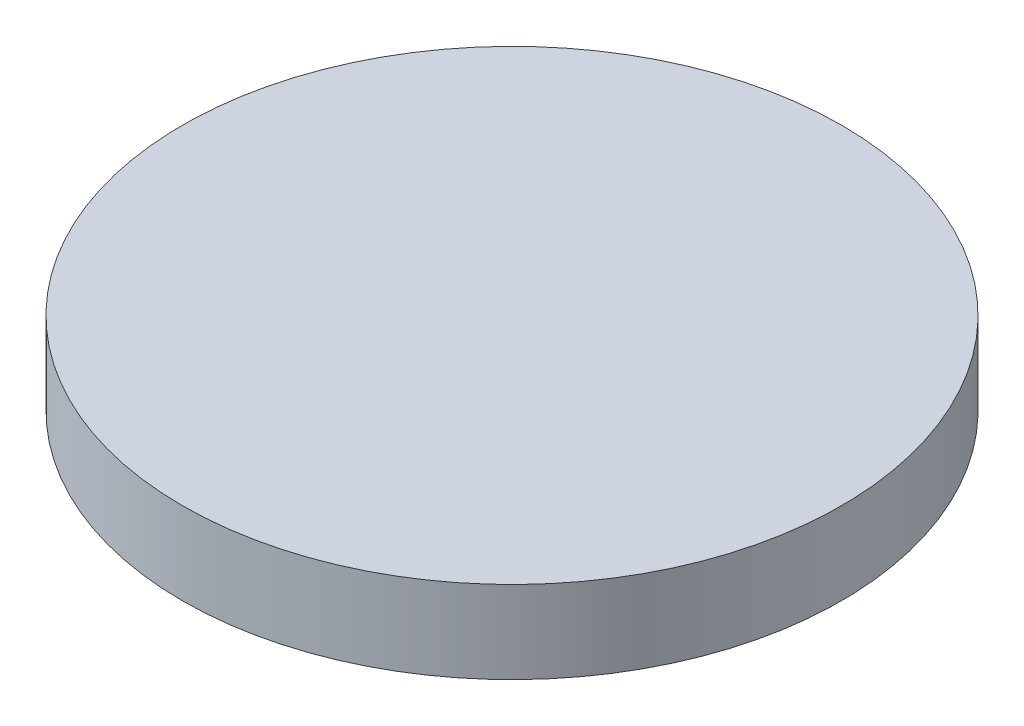
ISO-10303-21;
HEADER;
FILE_DESCRIPTION(('STEP AP214'),'2;1');
FILE_NAME('part.step','',(''),(''),'','','');
FILE_SCHEMA(('AUTOMOTIVE_DESIGN { 1 0 10303 214 1 1 1 1 }'));
ENDSEC;
DATA;
#1=APPLICATION_CONTEXT('core data for automotive mechanical design processes');
#2=APPLICATION_PROTOCOL_DEFINITION('international standard','automotive_design',2000,#1);
#3=PRODUCT_CONTEXT('',#1,'mechanical');
#4=PRODUCT('Part','Part','',(#3));
#5=PRODUCT_RELATED_PRODUCT_CATEGORY('part','',(#4));
#6=PRODUCT_DEFINITION_FORMATION('','',#4);
#7=PRODUCT_DEFINITION_CONTEXT('part definition',#1,'design');
#8=PRODUCT_DEFINITION('design','',#6,#7);
#9=PRODUCT_DEFINITION_SHAPE('','',#8);
#10=(LENGTH_UNIT() NAMED_UNIT(*) SI_UNIT(.MILLI.,.METRE.));
#11=(NAMED_UNIT(*) PLANE_ANGLE_UNIT() SI_UNIT($,.RADIAN.));
#12=(NAMED_UNIT(*) SI_UNIT($,.STERADIAN.) SOLID_ANGLE_UNIT());
#13=UNCERTAINTY_MEASURE_WITH_UNIT(LENGTH_MEASURE(1.E-05),#10,'distance_accuracy_value','');
#14=(GEOMETRIC_REPRESENTATION_CONTEXT(3) GLOBAL_UNCERTAINTY_ASSIGNED_CONTEXT((#13)) GLOBAL_UNIT_ASSIGNED_CONTEXT((#10,
#11,#12)) REPRESENTATION_CONTEXT('',''));
#15=CARTESIAN_POINT('',(0.,0.,0.));
#16=DIRECTION('',(0.,0.,1.));
#17=DIRECTION('',(1.,0.,0.));
#18=AXIS2_PLACEMENT_3D('',#15,#16,#17);
#19=CARTESIAN_POINT('',(0.,3.,0.));
#20=DIRECTION('',(0.,-1.,0.));
#21=DIRECTION('',(0.,0.,-1.));
#22=AXIS2_PLACEMENT_3D('',#19,#20,#21);
#23=CYLINDRICAL_SURFACE('',#22,12.);
#24=CARTESIAN_POINT('',(0.,3.,0.));
#25=DIRECTION('',(0.,1.,0.));
#26=DIRECTION('',(0.,0.,1.));
#27=AXIS2_PLACEMENT_3D('',#24,#25,#26);
#28=CIRCLE('',#27,12.);
#29=CARTESIAN_POINT('',(0.,3.,12.));
#30=VERTEX_POINT('',#29);
#31=EDGE_CURVE('E10',#30,#30,#28,.T.);
#32=ORIENTED_EDGE('',*,*,#31,.F.);
#33=EDGE_LOOP('',(#32));
#34=FACE_BOUND('',#33,.T.);
#35=CARTESIAN_POINT('',(0.,0.,0.));
#36=DIRECTION('',(0.,1.,0.));
#37=DIRECTION('',(0.,0.,1.));
#38=AXIS2_PLACEMENT_3D('',#35,#36,#37);
#39=CIRCLE('',#38,12.);
#40=CARTESIAN_POINT('',(0.,0.,12.));
#41=VERTEX_POINT('',#40);
#42=EDGE_CURVE('E40',#41,#41,#39,.T.);
#43=ORIENTED_EDGE('',*,*,#42,.T.);
#44=EDGE_LOOP('',(#43));
#45=FACE_BOUND('',#44,.T.);
#46=ADVANCED_FACE('F37',(#34,#45),#23,.T.);
#47=CARTESIAN_POINT('',(0.,3.,0.));
#48=DIRECTION('',(0.,1.,0.));
#49=DIRECTION('',(0.,0.,1.));
#50=AXIS2_PLACEMENT_3D('',#47,#48,#49);
#51=PLANE('',#50);
#52=ORIENTED_EDGE('',*,*,#31,.T.);
#53=EDGE_LOOP('',(#52));
#54=FACE_BOUND('',#53,.T.);
#55=ADVANCED_FACE('F54',(#54),#51,.T.);
#56=CARTESIAN_POINT('',(0.,0.,0.));
#57=DIRECTION('',(0.,1.,0.));
#58=DIRECTION('',(0.,0.,1.));
#59=AXIS2_PLACEMENT_3D('',#56,#57,#58);
#60=PLANE('',#59);
#61=ORIENTED_EDGE('',*,*,#42,.F.);
#62=EDGE_LOOP('',(#61));
#63=FACE_BOUND('',#62,.T.);
#64=ADVANCED_FACE('F52',(#63),#60,.F.);
#65=CLOSED_SHELL('',(#46,#55,#64));
#66=MANIFOLD_SOLID_BREP('B2',#65);
#67=ADVANCED_BREP_SHAPE_REPRESENTATION('',(#18,#66),#14);
#68=SHAPE_DEFINITION_REPRESENTATION(#9,#67);
ENDSEC;
END-ISO-10303-21;
